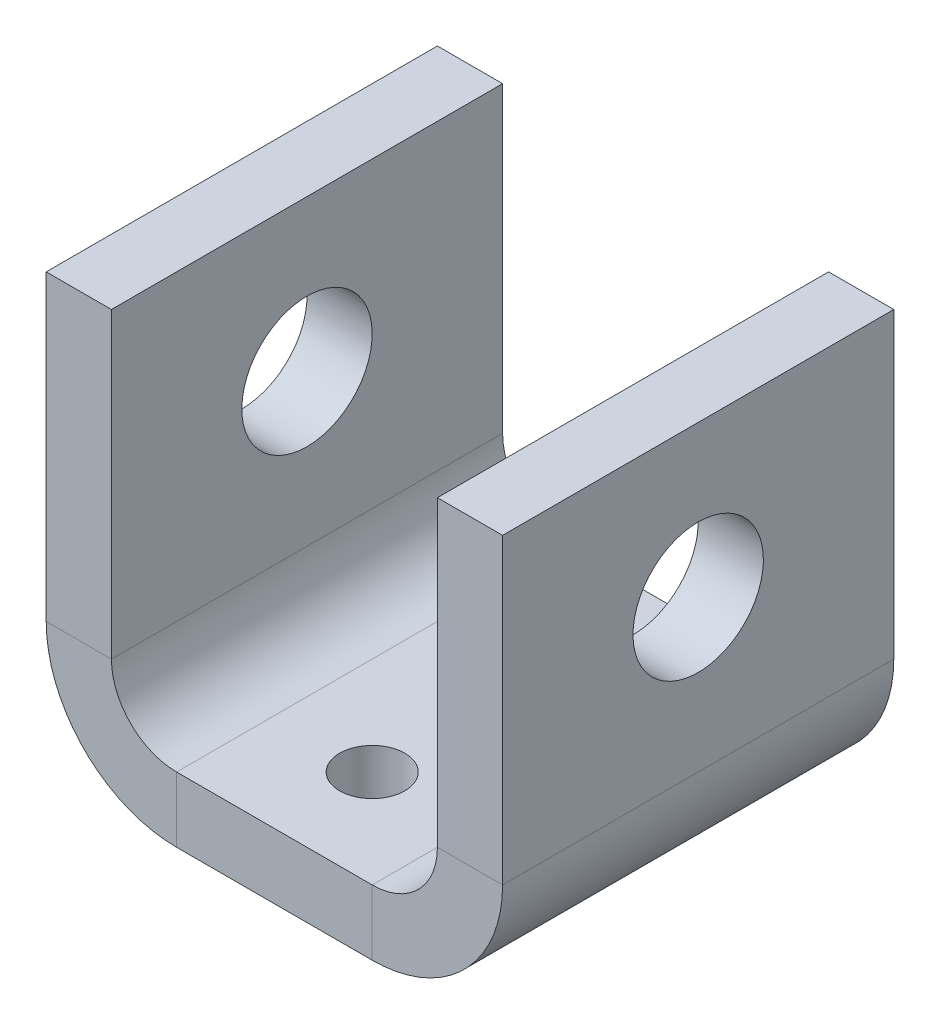
ISO-10303-21;
HEADER;
FILE_DESCRIPTION(('STEP AP214'),'2;1');
FILE_NAME('part.step','',(''),(''),'','','');
FILE_SCHEMA(('AUTOMOTIVE_DESIGN { 1 0 10303 214 1 1 1 1 }'));
ENDSEC;
DATA;
#1=APPLICATION_CONTEXT('core data for automotive mechanical design processes');
#2=APPLICATION_PROTOCOL_DEFINITION('international standard','automotive_design',2000,#1);
#3=PRODUCT_CONTEXT('',#1,'mechanical');
#4=PRODUCT('Part','Part','',(#3));
#5=PRODUCT_RELATED_PRODUCT_CATEGORY('part','',(#4));
#6=PRODUCT_DEFINITION_FORMATION('','',#4);
#7=PRODUCT_DEFINITION_CONTEXT('part definition',#1,'design');
#8=PRODUCT_DEFINITION('design','',#6,#7);
#9=PRODUCT_DEFINITION_SHAPE('','',#8);
#10=(LENGTH_UNIT() NAMED_UNIT(*) SI_UNIT(.MILLI.,.METRE.));
#11=(NAMED_UNIT(*) PLANE_ANGLE_UNIT() SI_UNIT($,.RADIAN.));
#12=(NAMED_UNIT(*) SI_UNIT($,.STERADIAN.) SOLID_ANGLE_UNIT());
#13=UNCERTAINTY_MEASURE_WITH_UNIT(LENGTH_MEASURE(1.E-05),#10,'distance_accuracy_value','');
#14=(GEOMETRIC_REPRESENTATION_CONTEXT(3) GLOBAL_UNCERTAINTY_ASSIGNED_CONTEXT((#13)) GLOBAL_UNIT_ASSIGNED_CONTEXT((#10,
#11,#12)) REPRESENTATION_CONTEXT('',''));
#15=CARTESIAN_POINT('',(0.,0.,0.));
#16=DIRECTION('',(0.,0.,1.));
#17=DIRECTION('',(1.,0.,0.));
#18=AXIS2_PLACEMENT_3D('',#15,#16,#17);
#19=CARTESIAN_POINT('',(0.,-5.,0.));
#20=DIRECTION('',(0.,-1.,0.));
#21=DIRECTION('',(0.,0.,-1.));
#22=AXIS2_PLACEMENT_3D('',#19,#20,#21);
#23=PLANE('',#22);
#24=CARTESIAN_POINT('',(0.,-5.,7.5));
#25=DIRECTION('',(0.,-1.,0.));
#26=DIRECTION('',(0.,0.,-1.));
#27=AXIS2_PLACEMENT_3D('',#24,#25,#26);
#28=CIRCLE('',#27,2.5);
#29=CARTESIAN_POINT('',(0.,-5.,5.));
#30=VERTEX_POINT('',#29);
#31=EDGE_CURVE('E266',#30,#30,#28,.T.);
#32=ORIENTED_EDGE('',*,*,#31,.F.);
#33=EDGE_LOOP('',(#32));
#34=FACE_BOUND('',#33,.T.);
#35=CARTESIAN_POINT('',(0.,-5.,-7.5));
#36=DIRECTION('',(0.,-1.,0.));
#37=DIRECTION('',(0.,0.,-1.));
#38=AXIS2_PLACEMENT_3D('',#35,#36,#37);
#39=CIRCLE('',#38,2.5);
#40=CARTESIAN_POINT('',(0.,-5.,-10.));
#41=VERTEX_POINT('',#40);
#42=EDGE_CURVE('E272',#41,#41,#39,.T.);
#43=ORIENTED_EDGE('',*,*,#42,.F.);
#44=EDGE_LOOP('',(#43));
#45=FACE_BOUND('',#44,.T.);
#46=DIRECTION('',(-1.,0.,0.));
#47=VECTOR('',#46,1.);
#48=CARTESIAN_POINT('',(-42.5,-5.,-15.));
#49=LINE('',#48,#47);
#50=CARTESIAN_POINT('',(7.50000000000002,-5.,-15.));
#51=VERTEX_POINT('',#50);
#52=CARTESIAN_POINT('',(-7.49999999999999,-5.,-15.));
#53=VERTEX_POINT('',#52);
#54=EDGE_CURVE('E254',#51,#53,#49,.T.);
#55=ORIENTED_EDGE('',*,*,#54,.F.);
#56=DIRECTION('',(0.,0.,1.));
#57=VECTOR('',#56,1.);
#58=CARTESIAN_POINT('',(7.50000000000001,-5.,0.));
#59=LINE('',#58,#57);
#60=CARTESIAN_POINT('',(7.50000000000001,-5.,15.));
#61=VERTEX_POINT('',#60);
#62=EDGE_CURVE('E245',#51,#61,#59,.T.);
#63=ORIENTED_EDGE('',*,*,#62,.T.);
#64=DIRECTION('',(1.,0.,0.));
#65=VECTOR('',#64,1.);
#66=CARTESIAN_POINT('',(-42.5,-5.,15.));
#67=LINE('',#66,#65);
#68=CARTESIAN_POINT('',(-7.49999999999999,-5.,15.));
#69=VERTEX_POINT('',#68);
#70=EDGE_CURVE('E237',#69,#61,#67,.T.);
#71=ORIENTED_EDGE('',*,*,#70,.F.);
#72=DIRECTION('',(0.,0.,1.));
#73=VECTOR('',#72,1.);
#74=CARTESIAN_POINT('',(-7.49999999999999,-5.,0.));
#75=LINE('',#74,#73);
#76=EDGE_CURVE('E233',#53,#69,#75,.T.);
#77=ORIENTED_EDGE('',*,*,#76,.F.);
#78=EDGE_LOOP('',(#55,#63,#71,#77));
#79=FACE_BOUND('',#78,.T.);
#80=ADVANCED_FACE('F53',(#34,#45,#79),#23,.T.);
#81=CARTESIAN_POINT('',(-42.5,-5.,-15.));
#82=DIRECTION('',(0.,0.,-1.));
#83=DIRECTION('',(-1.,0.,0.));
#84=AXIS2_PLACEMENT_3D('',#81,#82,#83);
#85=PLANE('',#84);
#86=DIRECTION('',(-1.,0.,0.));
#87=VECTOR('',#86,1.);
#88=CARTESIAN_POINT('',(-42.5,0.,-15.));
#89=LINE('',#88,#87);
#90=CARTESIAN_POINT('',(7.50000000000001,0.,-15.));
#91=VERTEX_POINT('',#90);
#92=CARTESIAN_POINT('',(-7.49999999999999,0.,-15.));
#93=VERTEX_POINT('',#92);
#94=EDGE_CURVE('E76',#91,#93,#89,.T.);
#95=ORIENTED_EDGE('',*,*,#94,.F.);
#96=DIRECTION('',(0.,-1.,0.));
#97=VECTOR('',#96,1.);
#98=CARTESIAN_POINT('',(7.50000000000001,-5.,-15.));
#99=LINE('',#98,#97);
#100=EDGE_CURVE('E248',#91,#51,#99,.T.);
#101=ORIENTED_EDGE('',*,*,#100,.T.);
#102=ORIENTED_EDGE('',*,*,#54,.T.);
#103=DIRECTION('',(0.,-1.,0.));
#104=VECTOR('',#103,1.);
#105=CARTESIAN_POINT('',(-7.49999999999999,-5.,-15.));
#106=LINE('',#105,#104);
#107=EDGE_CURVE('E242',#93,#53,#106,.T.);
#108=ORIENTED_EDGE('',*,*,#107,.F.);
#109=EDGE_LOOP('',(#95,#101,#102,#108));
#110=FACE_BOUND('',#109,.T.);
#111=ADVANCED_FACE('F306',(#110),#85,.T.);
#112=CARTESIAN_POINT('',(-42.5,-5.,15.));
#113=DIRECTION('',(0.,0.,1.));
#114=DIRECTION('',(1.,0.,0.));
#115=AXIS2_PLACEMENT_3D('',#112,#113,#114);
#116=PLANE('',#115);
#117=ORIENTED_EDGE('',*,*,#70,.T.);
#118=DIRECTION('',(0.,1.,0.));
#119=VECTOR('',#118,1.);
#120=CARTESIAN_POINT('',(7.50000000000001,-5.,15.));
#121=LINE('',#120,#119);
#122=CARTESIAN_POINT('',(7.50000000000001,0.,15.));
#123=VERTEX_POINT('',#122);
#124=EDGE_CURVE('E12',#61,#123,#121,.T.);
#125=ORIENTED_EDGE('',*,*,#124,.T.);
#126=DIRECTION('',(1.,0.,0.));
#127=VECTOR('',#126,1.);
#128=CARTESIAN_POINT('',(-42.5,0.,15.));
#129=LINE('',#128,#127);
#130=CARTESIAN_POINT('',(-7.49999999999999,0.,15.));
#131=VERTEX_POINT('',#130);
#132=EDGE_CURVE('E255',#131,#123,#129,.T.);
#133=ORIENTED_EDGE('',*,*,#132,.F.);
#134=DIRECTION('',(0.,1.,0.));
#135=VECTOR('',#134,1.);
#136=CARTESIAN_POINT('',(-7.49999999999999,-5.,15.));
#137=LINE('',#136,#135);
#138=EDGE_CURVE('E236',#69,#131,#137,.T.);
#139=ORIENTED_EDGE('',*,*,#138,.F.);
#140=EDGE_LOOP('',(#117,#125,#133,#139));
#141=FACE_BOUND('',#140,.T.);
#142=ADVANCED_FACE('F55',(#141),#116,.T.);
#143=CARTESIAN_POINT('',(0.,0.,0.));
#144=DIRECTION('',(0.,-1.,0.));
#145=DIRECTION('',(0.,0.,-1.));
#146=AXIS2_PLACEMENT_3D('',#143,#144,#145);
#147=PLANE('',#146);
#148=CARTESIAN_POINT('',(0.,0.,7.5));
#149=DIRECTION('',(0.,-1.,0.));
#150=DIRECTION('',(0.,0.,-1.));
#151=AXIS2_PLACEMENT_3D('',#148,#149,#150);
#152=CIRCLE('',#151,2.5);
#153=CARTESIAN_POINT('',(0.,0.,5.));
#154=VERTEX_POINT('',#153);
#155=EDGE_CURVE('E57',#154,#154,#152,.T.);
#156=ORIENTED_EDGE('',*,*,#155,.T.);
#157=EDGE_LOOP('',(#156));
#158=FACE_BOUND('',#157,.T.);
#159=CARTESIAN_POINT('',(0.,0.,-7.5));
#160=DIRECTION('',(0.,-1.,0.));
#161=DIRECTION('',(0.,0.,-1.));
#162=AXIS2_PLACEMENT_3D('',#159,#160,#161);
#163=CIRCLE('',#162,2.5);
#164=CARTESIAN_POINT('',(0.,0.,-10.));
#165=VERTEX_POINT('',#164);
#166=EDGE_CURVE('E264',#165,#165,#163,.T.);
#167=ORIENTED_EDGE('',*,*,#166,.T.);
#168=EDGE_LOOP('',(#167));
#169=FACE_BOUND('',#168,.T.);
#170=DIRECTION('',(0.,0.,1.));
#171=VECTOR('',#170,1.);
#172=CARTESIAN_POINT('',(7.50000000000001,0.,0.));
#173=LINE('',#172,#171);
#174=EDGE_CURVE('E62',#91,#123,#173,.T.);
#175=ORIENTED_EDGE('',*,*,#174,.F.);
#176=ORIENTED_EDGE('',*,*,#94,.T.);
#177=DIRECTION('',(0.,0.,1.));
#178=VECTOR('',#177,1.);
#179=CARTESIAN_POINT('',(-7.49999999999999,0.,0.));
#180=LINE('',#179,#178);
#181=EDGE_CURVE('E240',#93,#131,#180,.T.);
#182=ORIENTED_EDGE('',*,*,#181,.T.);
#183=ORIENTED_EDGE('',*,*,#132,.T.);
#184=EDGE_LOOP('',(#175,#176,#182,#183));
#185=FACE_BOUND('',#184,.T.);
#186=ADVANCED_FACE('F370',(#158,#169,#185),#147,.F.);
#187=CARTESIAN_POINT('',(-7.49999999999999,5.,-15.));
#188=DIRECTION('',(0.,0.,-1.));
#189=DIRECTION('',(-1.,0.,0.));
#190=AXIS2_PLACEMENT_3D('',#187,#188,#189);
#191=PLANE('',#190);
#192=DIRECTION('',(-1.,0.,0.));
#193=VECTOR('',#192,1.);
#194=CARTESIAN_POINT('',(-17.5,5.00000000000003,-15.));
#195=LINE('',#194,#193);
#196=CARTESIAN_POINT('',(-12.5,5.00000000000001,-15.));
#197=VERTEX_POINT('',#196);
#198=CARTESIAN_POINT('',(-17.5,5.00000000000003,-15.));
#199=VERTEX_POINT('',#198);
#200=EDGE_CURVE('E198',#197,#199,#195,.T.);
#201=ORIENTED_EDGE('',*,*,#200,.F.);
#202=CARTESIAN_POINT('',(-7.49999999999999,5.,-15.));
#203=DIRECTION('',(0.,0.,-1.));
#204=DIRECTION('',(-1.,0.,0.));
#205=AXIS2_PLACEMENT_3D('',#202,#203,#204);
#206=CIRCLE('',#205,5.);
#207=EDGE_CURVE('E195',#197,#93,#206,.F.);
#208=ORIENTED_EDGE('',*,*,#207,.T.);
#209=ORIENTED_EDGE('',*,*,#107,.T.);
#210=CARTESIAN_POINT('',(-7.49999999999999,5.,-15.));
#211=DIRECTION('',(0.,0.,1.));
#212=DIRECTION('',(-1.,0.,0.));
#213=AXIS2_PLACEMENT_3D('',#210,#211,#212);
#214=CIRCLE('',#213,10.);
#215=EDGE_CURVE('E222',#199,#53,#214,.T.);
#216=ORIENTED_EDGE('',*,*,#215,.F.);
#217=EDGE_LOOP('',(#201,#208,#209,#216));
#218=FACE_BOUND('',#217,.T.);
#219=ADVANCED_FACE('F336',(#218),#191,.T.);
#220=CARTESIAN_POINT('',(-7.49999999999999,5.,15.));
#221=DIRECTION('',(0.,0.,1.));
#222=DIRECTION('',(0.,-1.,0.));
#223=AXIS2_PLACEMENT_3D('',#220,#221,#222);
#224=PLANE('',#223);
#225=CARTESIAN_POINT('',(-7.49999999999999,5.,15.));
#226=DIRECTION('',(0.,0.,-1.));
#227=DIRECTION('',(-1.,0.,0.));
#228=AXIS2_PLACEMENT_3D('',#225,#226,#227);
#229=CIRCLE('',#228,5.);
#230=CARTESIAN_POINT('',(-12.5,5.00000000000002,15.));
#231=VERTEX_POINT('',#230);
#232=EDGE_CURVE('E226',#131,#231,#229,.T.);
#233=ORIENTED_EDGE('',*,*,#232,.T.);
#234=DIRECTION('',(1.,0.,0.));
#235=VECTOR('',#234,1.);
#236=CARTESIAN_POINT('',(-17.5,5.00000000000003,15.));
#237=LINE('',#236,#235);
#238=CARTESIAN_POINT('',(-17.5,5.00000000000003,15.));
#239=VERTEX_POINT('',#238);
#240=EDGE_CURVE('E207',#239,#231,#237,.T.);
#241=ORIENTED_EDGE('',*,*,#240,.F.);
#242=CARTESIAN_POINT('',(-7.49999999999999,5.,15.));
#243=DIRECTION('',(0.,0.,-1.));
#244=DIRECTION('',(0.,-1.,0.));
#245=AXIS2_PLACEMENT_3D('',#242,#243,#244);
#246=CIRCLE('',#245,10.);
#247=EDGE_CURVE('E225',#69,#239,#246,.T.);
#248=ORIENTED_EDGE('',*,*,#247,.F.);
#249=ORIENTED_EDGE('',*,*,#138,.T.);
#250=EDGE_LOOP('',(#233,#241,#248,#249));
#251=FACE_BOUND('',#250,.T.);
#252=ADVANCED_FACE('F322',(#251),#224,.T.);
#253=CARTESIAN_POINT('',(-7.49999999999998,5.,32.6158138314885));
#254=DIRECTION('',(0.,0.,-1.));
#255=DIRECTION('',(-1.,0.,0.));
#256=AXIS2_PLACEMENT_3D('',#253,#254,#255);
#257=CYLINDRICAL_SURFACE('',#256,10.);
#258=ORIENTED_EDGE('',*,*,#76,.T.);
#259=ORIENTED_EDGE('',*,*,#247,.T.);
#260=DIRECTION('',(0.,0.,1.));
#261=VECTOR('',#260,1.);
#262=CARTESIAN_POINT('',(-17.5,5.00000000000003,0.));
#263=LINE('',#262,#261);
#264=EDGE_CURVE('E213',#199,#239,#263,.T.);
#265=ORIENTED_EDGE('',*,*,#264,.F.);
#266=ORIENTED_EDGE('',*,*,#215,.T.);
#267=EDGE_LOOP('',(#258,#259,#265,#266));
#268=FACE_BOUND('',#267,.T.);
#269=ADVANCED_FACE('F318',(#268),#257,.T.);
#270=CARTESIAN_POINT('',(-7.49999999999998,5.,32.6158138314885));
#271=DIRECTION('',(0.,0.,-1.));
#272=DIRECTION('',(-1.,0.,0.));
#273=AXIS2_PLACEMENT_3D('',#270,#271,#272);
#274=CYLINDRICAL_SURFACE('',#273,5.);
#275=ORIENTED_EDGE('',*,*,#181,.F.);
#276=ORIENTED_EDGE('',*,*,#207,.F.);
#277=DIRECTION('',(0.,0.,1.));
#278=VECTOR('',#277,1.);
#279=CARTESIAN_POINT('',(-12.5,5.00000000000002,0.));
#280=LINE('',#279,#278);
#281=EDGE_CURVE('E188',#197,#231,#280,.T.);
#282=ORIENTED_EDGE('',*,*,#281,.T.);
#283=ORIENTED_EDGE('',*,*,#232,.F.);
#284=EDGE_LOOP('',(#275,#276,#282,#283));
#285=FACE_BOUND('',#284,.T.);
#286=ADVANCED_FACE('F331',(#285),#274,.F.);
#287=CARTESIAN_POINT('',(-17.4999999999999,28.2190275490383,15.));
#288=DIRECTION('',(0.,1.,0.));
#289=DIRECTION('',(0.,0.,1.));
#290=AXIS2_PLACEMENT_3D('',#287,#288,#289);
#291=PLANE('',#290);
#292=DIRECTION('',(0.,0.,1.));
#293=VECTOR('',#292,1.);
#294=CARTESIAN_POINT('',(-12.4999999999999,28.2190275490383,15.));
#295=LINE('',#294,#293);
#296=CARTESIAN_POINT('',(-12.4999999999999,28.2190275490383,-15.));
#297=VERTEX_POINT('',#296);
#298=CARTESIAN_POINT('',(-12.4999999999999,28.2190275490383,15.));
#299=VERTEX_POINT('',#298);
#300=EDGE_CURVE('E202',#297,#299,#295,.T.);
#301=ORIENTED_EDGE('',*,*,#300,.F.);
#302=DIRECTION('',(1.,0.,0.));
#303=VECTOR('',#302,1.);
#304=CARTESIAN_POINT('',(-17.4999999999999,28.2190275490383,-15.));
#305=LINE('',#304,#303);
#306=CARTESIAN_POINT('',(-17.4999999999999,28.2190275490383,-15.));
#307=VERTEX_POINT('',#306);
#308=EDGE_CURVE('E192',#307,#297,#305,.T.);
#309=ORIENTED_EDGE('',*,*,#308,.F.);
#310=DIRECTION('',(0.,0.,1.));
#311=VECTOR('',#310,1.);
#312=CARTESIAN_POINT('',(-17.4999999999999,28.2190275490383,15.));
#313=LINE('',#312,#311);
#314=CARTESIAN_POINT('',(-17.4999999999999,28.2190275490383,15.));
#315=VERTEX_POINT('',#314);
#316=EDGE_CURVE('E217',#307,#315,#313,.T.);
#317=ORIENTED_EDGE('',*,*,#316,.T.);
#318=DIRECTION('',(1.,0.,0.));
#319=VECTOR('',#318,1.);
#320=CARTESIAN_POINT('',(-17.4999999999999,28.2190275490383,15.));
#321=LINE('',#320,#319);
#322=EDGE_CURVE('E215',#315,#299,#321,.T.);
#323=ORIENTED_EDGE('',*,*,#322,.T.);
#324=EDGE_LOOP('',(#301,#309,#317,#323));
#325=FACE_BOUND('',#324,.T.);
#326=ADVANCED_FACE('F346',(#325),#291,.T.);
#327=CARTESIAN_POINT('',(-17.5000000000001,-14.2809724509617,0.));
#328=DIRECTION('',(-1.,0.,0.));
#329=DIRECTION('',(0.,0.,-1.));
#330=AXIS2_PLACEMENT_3D('',#327,#328,#329);
#331=PLANE('',#330);
#332=CARTESIAN_POINT('',(-17.5,16.609513774519,0.));
#333=DIRECTION('',(-1.,0.,0.));
#334=DIRECTION('',(0.,-1.,0.));
#335=AXIS2_PLACEMENT_3D('',#332,#333,#334);
#336=CIRCLE('',#335,5.);
#337=CARTESIAN_POINT('',(-17.5,11.609513774519,0.));
#338=VERTEX_POINT('',#337);
#339=EDGE_CURVE('E263',#338,#338,#336,.F.);
#340=ORIENTED_EDGE('',*,*,#339,.T.);
#341=EDGE_LOOP('',(#340));
#342=FACE_BOUND('',#341,.T.);
#343=DIRECTION('',(0.,1.,0.));
#344=VECTOR('',#343,1.);
#345=CARTESIAN_POINT('',(-17.4999999999999,28.2190275490383,-15.));
#346=LINE('',#345,#344);
#347=EDGE_CURVE('E196',#199,#307,#346,.T.);
#348=ORIENTED_EDGE('',*,*,#347,.F.);
#349=ORIENTED_EDGE('',*,*,#264,.T.);
#350=DIRECTION('',(0.,-1.,0.));
#351=VECTOR('',#350,1.);
#352=CARTESIAN_POINT('',(-17.4999999999999,28.2190275490383,15.));
#353=LINE('',#352,#351);
#354=EDGE_CURVE('E210',#315,#239,#353,.T.);
#355=ORIENTED_EDGE('',*,*,#354,.F.);
#356=ORIENTED_EDGE('',*,*,#316,.F.);
#357=EDGE_LOOP('',(#348,#349,#355,#356));
#358=FACE_BOUND('',#357,.T.);
#359=ADVANCED_FACE('F343',(#342,#358),#331,.T.);
#360=CARTESIAN_POINT('',(-17.4999999999999,28.2190275490383,15.));
#361=DIRECTION('',(0.,0.,1.));
#362=DIRECTION('',(0.,-1.,0.));
#363=AXIS2_PLACEMENT_3D('',#360,#361,#362);
#364=PLANE('',#363);
#365=ORIENTED_EDGE('',*,*,#354,.T.);
#366=ORIENTED_EDGE('',*,*,#240,.T.);
#367=DIRECTION('',(0.,-1.,0.));
#368=VECTOR('',#367,1.);
#369=CARTESIAN_POINT('',(-12.4999999999999,28.2190275490383,15.));
#370=LINE('',#369,#368);
#371=EDGE_CURVE('E200',#299,#231,#370,.T.);
#372=ORIENTED_EDGE('',*,*,#371,.F.);
#373=ORIENTED_EDGE('',*,*,#322,.F.);
#374=EDGE_LOOP('',(#365,#366,#372,#373));
#375=FACE_BOUND('',#374,.T.);
#376=ADVANCED_FACE('F325',(#375),#364,.T.);
#377=CARTESIAN_POINT('',(-12.5000000000001,-14.2809724509617,0.));
#378=DIRECTION('',(-1.,0.,0.));
#379=DIRECTION('',(0.,0.,-1.));
#380=AXIS2_PLACEMENT_3D('',#377,#378,#379);
#381=PLANE('',#380);
#382=CARTESIAN_POINT('',(-12.4999999999999,16.6095137745191,0.));
#383=DIRECTION('',(-1.,0.,0.));
#384=DIRECTION('',(0.,-1.,0.));
#385=AXIS2_PLACEMENT_3D('',#382,#383,#384);
#386=CIRCLE('',#385,5.);
#387=CARTESIAN_POINT('',(-12.5,11.6095137745191,0.));
#388=VERTEX_POINT('',#387);
#389=EDGE_CURVE('E180',#388,#388,#386,.T.);
#390=ORIENTED_EDGE('',*,*,#389,.T.);
#391=EDGE_LOOP('',(#390));
#392=FACE_BOUND('',#391,.T.);
#393=ORIENTED_EDGE('',*,*,#281,.F.);
#394=DIRECTION('',(0.,1.,0.));
#395=VECTOR('',#394,1.);
#396=CARTESIAN_POINT('',(-12.4999999999999,28.2190275490383,-15.));
#397=LINE('',#396,#395);
#398=EDGE_CURVE('E205',#197,#297,#397,.T.);
#399=ORIENTED_EDGE('',*,*,#398,.T.);
#400=ORIENTED_EDGE('',*,*,#300,.T.);
#401=ORIENTED_EDGE('',*,*,#371,.T.);
#402=EDGE_LOOP('',(#393,#399,#400,#401));
#403=FACE_BOUND('',#402,.T.);
#404=ADVANCED_FACE('F334',(#392,#403),#381,.F.);
#405=CARTESIAN_POINT('',(-17.4999999999999,28.2190275490383,-15.));
#406=DIRECTION('',(0.,0.,-1.));
#407=DIRECTION('',(0.,1.,0.));
#408=AXIS2_PLACEMENT_3D('',#405,#406,#407);
#409=PLANE('',#408);
#410=ORIENTED_EDGE('',*,*,#398,.F.);
#411=ORIENTED_EDGE('',*,*,#200,.T.);
#412=ORIENTED_EDGE('',*,*,#347,.T.);
#413=ORIENTED_EDGE('',*,*,#308,.T.);
#414=EDGE_LOOP('',(#410,#411,#412,#413));
#415=FACE_BOUND('',#414,.T.);
#416=ADVANCED_FACE('F339',(#415),#409,.T.);
#417=CARTESIAN_POINT('',(7.50000000000001,5.,-15.));
#418=DIRECTION('',(0.,0.,-1.));
#419=DIRECTION('',(-1.,0.,0.));
#420=AXIS2_PLACEMENT_3D('',#417,#418,#419);
#421=PLANE('',#420);
#422=ORIENTED_EDGE('',*,*,#100,.F.);
#423=CARTESIAN_POINT('',(7.50000000000001,5.,-15.));
#424=DIRECTION('',(0.,0.,1.));
#425=DIRECTION('',(1.,0.,0.));
#426=AXIS2_PLACEMENT_3D('',#423,#424,#425);
#427=CIRCLE('',#426,5.);
#428=CARTESIAN_POINT('',(12.5,5.00000000000002,-15.));
#429=VERTEX_POINT('',#428);
#430=EDGE_CURVE('E163',#91,#429,#427,.T.);
#431=ORIENTED_EDGE('',*,*,#430,.T.);
#432=DIRECTION('',(1.,0.,0.));
#433=VECTOR('',#432,1.);
#434=CARTESIAN_POINT('',(17.5,5.00000000000003,-15.));
#435=LINE('',#434,#433);
#436=CARTESIAN_POINT('',(17.5,5.00000000000003,-15.));
#437=VERTEX_POINT('',#436);
#438=EDGE_CURVE('E170',#429,#437,#435,.T.);
#439=ORIENTED_EDGE('',*,*,#438,.T.);
#440=CARTESIAN_POINT('',(7.50000000000001,5.,-15.));
#441=DIRECTION('',(0.,0.,1.));
#442=DIRECTION('',(-1.,0.,0.));
#443=AXIS2_PLACEMENT_3D('',#440,#441,#442);
#444=CIRCLE('',#443,10.);
#445=EDGE_CURVE('E181',#51,#437,#444,.T.);
#446=ORIENTED_EDGE('',*,*,#445,.F.);
#447=EDGE_LOOP('',(#422,#431,#439,#446));
#448=FACE_BOUND('',#447,.T.);
#449=ADVANCED_FACE('F298',(#448),#421,.T.);
#450=CARTESIAN_POINT('',(7.50000000000001,5.,15.));
#451=DIRECTION('',(0.,0.,1.));
#452=DIRECTION('',(1.,0.,0.));
#453=AXIS2_PLACEMENT_3D('',#450,#451,#452);
#454=PLANE('',#453);
#455=DIRECTION('',(-1.,0.,0.));
#456=VECTOR('',#455,1.);
#457=CARTESIAN_POINT('',(17.5,5.00000000000003,15.));
#458=LINE('',#457,#456);
#459=CARTESIAN_POINT('',(17.5,5.00000000000003,15.));
#460=VERTEX_POINT('',#459);
#461=CARTESIAN_POINT('',(12.5,5.00000000000002,15.));
#462=VERTEX_POINT('',#461);
#463=EDGE_CURVE('E152',#460,#462,#458,.T.);
#464=ORIENTED_EDGE('',*,*,#463,.T.);
#465=CARTESIAN_POINT('',(7.50000000000001,5.,15.));
#466=DIRECTION('',(0.,0.,1.));
#467=DIRECTION('',(1.,0.,0.));
#468=AXIS2_PLACEMENT_3D('',#465,#466,#467);
#469=CIRCLE('',#468,5.);
#470=EDGE_CURVE('E185',#462,#123,#469,.F.);
#471=ORIENTED_EDGE('',*,*,#470,.T.);
#472=ORIENTED_EDGE('',*,*,#124,.F.);
#473=CARTESIAN_POINT('',(7.50000000000001,5.,15.));
#474=DIRECTION('',(0.,0.,-1.));
#475=DIRECTION('',(1.,0.,0.));
#476=AXIS2_PLACEMENT_3D('',#473,#474,#475);
#477=CIRCLE('',#476,10.);
#478=EDGE_CURVE('E184',#460,#61,#477,.T.);
#479=ORIENTED_EDGE('',*,*,#478,.F.);
#480=EDGE_LOOP('',(#464,#471,#472,#479));
#481=FACE_BOUND('',#480,.T.);
#482=ADVANCED_FACE('F311',(#481),#454,.T.);
#483=CARTESIAN_POINT('',(7.50000000000001,5.,-32.6158138314885));
#484=DIRECTION('',(0.,0.,1.));
#485=DIRECTION('',(1.,0.,0.));
#486=AXIS2_PLACEMENT_3D('',#483,#484,#485);
#487=CYLINDRICAL_SURFACE('',#486,10.);
#488=ORIENTED_EDGE('',*,*,#478,.T.);
#489=ORIENTED_EDGE('',*,*,#62,.F.);
#490=ORIENTED_EDGE('',*,*,#445,.T.);
#491=DIRECTION('',(0.,0.,1.));
#492=VECTOR('',#491,1.);
#493=CARTESIAN_POINT('',(17.5,5.00000000000004,0.));
#494=LINE('',#493,#492);
#495=EDGE_CURVE('E178',#437,#460,#494,.T.);
#496=ORIENTED_EDGE('',*,*,#495,.T.);
#497=EDGE_LOOP('',(#488,#489,#490,#496));
#498=FACE_BOUND('',#497,.T.);
#499=ADVANCED_FACE('F301',(#498),#487,.T.);
#500=CARTESIAN_POINT('',(7.50000000000001,5.,-32.6158138314885));
#501=DIRECTION('',(0.,0.,1.));
#502=DIRECTION('',(1.,0.,0.));
#503=AXIS2_PLACEMENT_3D('',#500,#501,#502);
#504=CYLINDRICAL_SURFACE('',#503,5.);
#505=ORIENTED_EDGE('',*,*,#470,.F.);
#506=DIRECTION('',(0.,0.,1.));
#507=VECTOR('',#506,1.);
#508=CARTESIAN_POINT('',(12.5,5.00000000000002,0.));
#509=LINE('',#508,#507);
#510=EDGE_CURVE('E288',#429,#462,#509,.T.);
#511=ORIENTED_EDGE('',*,*,#510,.F.);
#512=ORIENTED_EDGE('',*,*,#430,.F.);
#513=ORIENTED_EDGE('',*,*,#174,.T.);
#514=EDGE_LOOP('',(#505,#511,#512,#513));
#515=FACE_BOUND('',#514,.T.);
#516=ADVANCED_FACE('F307',(#515),#504,.F.);
#517=CARTESIAN_POINT('',(17.4999999999999,28.2190275490383,15.));
#518=DIRECTION('',(0.,1.,0.));
#519=DIRECTION('',(0.,0.,-1.));
#520=AXIS2_PLACEMENT_3D('',#517,#518,#519);
#521=PLANE('',#520);
#522=DIRECTION('',(0.,0.,-1.));
#523=VECTOR('',#522,1.);
#524=CARTESIAN_POINT('',(12.4999999999999,28.2190275490383,15.));
#525=LINE('',#524,#523);
#526=CARTESIAN_POINT('',(12.4999999999999,28.2190275490383,15.));
#527=VERTEX_POINT('',#526);
#528=CARTESIAN_POINT('',(12.4999999999999,28.2190275490383,-15.));
#529=VERTEX_POINT('',#528);
#530=EDGE_CURVE('E156',#527,#529,#525,.T.);
#531=ORIENTED_EDGE('',*,*,#530,.F.);
#532=DIRECTION('',(-1.,0.,0.));
#533=VECTOR('',#532,1.);
#534=CARTESIAN_POINT('',(17.4999999999999,28.2190275490383,15.));
#535=LINE('',#534,#533);
#536=CARTESIAN_POINT('',(17.4999999999999,28.2190275490383,15.));
#537=VERTEX_POINT('',#536);
#538=EDGE_CURVE('E149',#537,#527,#535,.T.);
#539=ORIENTED_EDGE('',*,*,#538,.F.);
#540=DIRECTION('',(0.,0.,-1.));
#541=VECTOR('',#540,1.);
#542=CARTESIAN_POINT('',(17.4999999999999,28.2190275490383,15.));
#543=LINE('',#542,#541);
#544=CARTESIAN_POINT('',(17.4999999999999,28.2190275490383,-15.));
#545=VERTEX_POINT('',#544);
#546=EDGE_CURVE('E161',#537,#545,#543,.T.);
#547=ORIENTED_EDGE('',*,*,#546,.T.);
#548=DIRECTION('',(-1.,0.,0.));
#549=VECTOR('',#548,1.);
#550=CARTESIAN_POINT('',(17.4999999999999,28.2190275490383,-15.));
#551=LINE('',#550,#549);
#552=EDGE_CURVE('E169',#545,#529,#551,.T.);
#553=ORIENTED_EDGE('',*,*,#552,.T.);
#554=EDGE_LOOP('',(#531,#539,#547,#553));
#555=FACE_BOUND('',#554,.T.);
#556=ADVANCED_FACE('F160',(#555),#521,.T.);
#557=CARTESIAN_POINT('',(17.5000000000001,-14.2809724509617,0.));
#558=DIRECTION('',(1.,0.,0.));
#559=DIRECTION('',(0.,0.,-1.));
#560=AXIS2_PLACEMENT_3D('',#557,#558,#559);
#561=PLANE('',#560);
#562=CARTESIAN_POINT('',(17.5,16.6095137745192,0.));
#563=DIRECTION('',(1.,0.,0.));
#564=DIRECTION('',(0.,1.,0.));
#565=AXIS2_PLACEMENT_3D('',#562,#563,#564);
#566=CIRCLE('',#565,5.);
#567=CARTESIAN_POINT('',(17.5,21.6095137745192,0.));
#568=VERTEX_POINT('',#567);
#569=EDGE_CURVE('E270',#568,#568,#566,.T.);
#570=ORIENTED_EDGE('',*,*,#569,.F.);
#571=EDGE_LOOP('',(#570));
#572=FACE_BOUND('',#571,.T.);
#573=ORIENTED_EDGE('',*,*,#495,.F.);
#574=DIRECTION('',(0.,-1.,0.));
#575=VECTOR('',#574,1.);
#576=CARTESIAN_POINT('',(17.5000000000002,-56.7809724509617,-15.));
#577=LINE('',#576,#575);
#578=EDGE_CURVE('E168',#545,#437,#577,.T.);
#579=ORIENTED_EDGE('',*,*,#578,.F.);
#580=ORIENTED_EDGE('',*,*,#546,.F.);
#581=DIRECTION('',(0.,1.,0.));
#582=VECTOR('',#581,1.);
#583=CARTESIAN_POINT('',(17.5000000000002,-56.7809724509617,15.));
#584=LINE('',#583,#582);
#585=EDGE_CURVE('E146',#460,#537,#584,.T.);
#586=ORIENTED_EDGE('',*,*,#585,.F.);
#587=EDGE_LOOP('',(#573,#579,#580,#586));
#588=FACE_BOUND('',#587,.T.);
#589=ADVANCED_FACE('F166',(#572,#588),#561,.T.);
#590=CARTESIAN_POINT('',(17.5000000000002,-56.7809724509617,-15.));
#591=DIRECTION('',(0.,0.,-1.));
#592=DIRECTION('',(0.,-1.,0.));
#593=AXIS2_PLACEMENT_3D('',#590,#591,#592);
#594=PLANE('',#593);
#595=ORIENTED_EDGE('',*,*,#438,.F.);
#596=DIRECTION('',(0.,-1.,0.));
#597=VECTOR('',#596,1.);
#598=CARTESIAN_POINT('',(12.5000000000002,-56.7809724509617,-15.));
#599=LINE('',#598,#597);
#600=EDGE_CURVE('E291',#529,#429,#599,.T.);
#601=ORIENTED_EDGE('',*,*,#600,.F.);
#602=ORIENTED_EDGE('',*,*,#552,.F.);
#603=ORIENTED_EDGE('',*,*,#578,.T.);
#604=EDGE_LOOP('',(#595,#601,#602,#603));
#605=FACE_BOUND('',#604,.T.);
#606=ADVANCED_FACE('F294',(#605),#594,.T.);
#607=CARTESIAN_POINT('',(12.5000000000001,-14.2809724509617,0.));
#608=DIRECTION('',(1.,0.,0.));
#609=DIRECTION('',(0.,0.,-1.));
#610=AXIS2_PLACEMENT_3D('',#607,#608,#609);
#611=PLANE('',#610);
#612=CARTESIAN_POINT('',(12.5,16.6095137745191,0.));
#613=DIRECTION('',(1.,0.,0.));
#614=DIRECTION('',(0.,1.,0.));
#615=AXIS2_PLACEMENT_3D('',#612,#613,#614);
#616=CIRCLE('',#615,5.);
#617=CARTESIAN_POINT('',(12.5,21.6095137745192,0.));
#618=VERTEX_POINT('',#617);
#619=EDGE_CURVE('E261',#618,#618,#616,.T.);
#620=ORIENTED_EDGE('',*,*,#619,.T.);
#621=EDGE_LOOP('',(#620));
#622=FACE_BOUND('',#621,.T.);
#623=ORIENTED_EDGE('',*,*,#600,.T.);
#624=ORIENTED_EDGE('',*,*,#510,.T.);
#625=DIRECTION('',(0.,1.,0.));
#626=VECTOR('',#625,1.);
#627=CARTESIAN_POINT('',(12.5000000000002,-56.7809724509617,15.));
#628=LINE('',#627,#626);
#629=EDGE_CURVE('E286',#462,#527,#628,.T.);
#630=ORIENTED_EDGE('',*,*,#629,.T.);
#631=ORIENTED_EDGE('',*,*,#530,.T.);
#632=EDGE_LOOP('',(#623,#624,#630,#631));
#633=FACE_BOUND('',#632,.T.);
#634=ADVANCED_FACE('F309',(#622,#633),#611,.F.);
#635=CARTESIAN_POINT('',(17.5000000000002,-56.7809724509617,15.));
#636=DIRECTION('',(0.,0.,1.));
#637=DIRECTION('',(0.,1.,0.));
#638=AXIS2_PLACEMENT_3D('',#635,#636,#637);
#639=PLANE('',#638);
#640=ORIENTED_EDGE('',*,*,#463,.F.);
#641=ORIENTED_EDGE('',*,*,#585,.T.);
#642=ORIENTED_EDGE('',*,*,#538,.T.);
#643=ORIENTED_EDGE('',*,*,#629,.F.);
#644=EDGE_LOOP('',(#640,#641,#642,#643));
#645=FACE_BOUND('',#644,.T.);
#646=ADVANCED_FACE('F148',(#645),#639,.T.);
#647=CARTESIAN_POINT('',(-31.6421356237309,16.609513774519,0.));
#648=DIRECTION('',(1.,0.,0.));
#649=DIRECTION('',(0.,1.,0.));
#650=AXIS2_PLACEMENT_3D('',#647,#648,#649);
#651=CYLINDRICAL_SURFACE('',#650,5.);
#652=ORIENTED_EDGE('',*,*,#569,.T.);
#653=EDGE_LOOP('',(#652));
#654=FACE_BOUND('',#653,.T.);
#655=ORIENTED_EDGE('',*,*,#619,.F.);
#656=EDGE_LOOP('',(#655));
#657=FACE_BOUND('',#656,.T.);
#658=ADVANCED_FACE('F390',(#654,#657),#651,.F.);
#659=ORIENTED_EDGE('',*,*,#339,.F.);
#660=EDGE_LOOP('',(#659));
#661=FACE_BOUND('',#660,.T.);
#662=ORIENTED_EDGE('',*,*,#389,.F.);
#663=EDGE_LOOP('',(#662));
#664=FACE_BOUND('',#663,.T.);
#665=ADVANCED_FACE('F385',(#661,#664),#651,.F.);
#666=CARTESIAN_POINT('',(0.,5.,-7.5));
#667=DIRECTION('',(0.,-1.,0.));
#668=DIRECTION('',(0.,0.,-1.));
#669=AXIS2_PLACEMENT_3D('',#666,#667,#668);
#670=CYLINDRICAL_SURFACE('',#669,2.5);
#671=ORIENTED_EDGE('',*,*,#42,.T.);
#672=EDGE_LOOP('',(#671));
#673=FACE_BOUND('',#672,.T.);
#674=ORIENTED_EDGE('',*,*,#166,.F.);
#675=EDGE_LOOP('',(#674));
#676=FACE_BOUND('',#675,.T.);
#677=ADVANCED_FACE('F381',(#673,#676),#670,.F.);
#678=CARTESIAN_POINT('',(0.,5.,7.5));
#679=DIRECTION('',(0.,-1.,0.));
#680=DIRECTION('',(0.,0.,-1.));
#681=AXIS2_PLACEMENT_3D('',#678,#679,#680);
#682=CYLINDRICAL_SURFACE('',#681,2.5);
#683=ORIENTED_EDGE('',*,*,#31,.T.);
#684=EDGE_LOOP('',(#683));
#685=FACE_BOUND('',#684,.T.);
#686=ORIENTED_EDGE('',*,*,#155,.F.);
#687=EDGE_LOOP('',(#686));
#688=FACE_BOUND('',#687,.T.);
#689=ADVANCED_FACE('F379',(#685,#688),#682,.F.);
#690=CLOSED_SHELL('',(#80,#111,#142,#186,#219,#252,#269,#286,#326,#359,#376,#404,#416,#449,#482,
#499,#516,#556,#589,#606,#634,#646,#658,#665,#677,#689));
#691=MANIFOLD_SOLID_BREP('B2',#690);
#692=ADVANCED_BREP_SHAPE_REPRESENTATION('',(#18,#691),#14);
#693=SHAPE_DEFINITION_REPRESENTATION(#9,#692);
ENDSEC;
END-ISO-10303-21;
